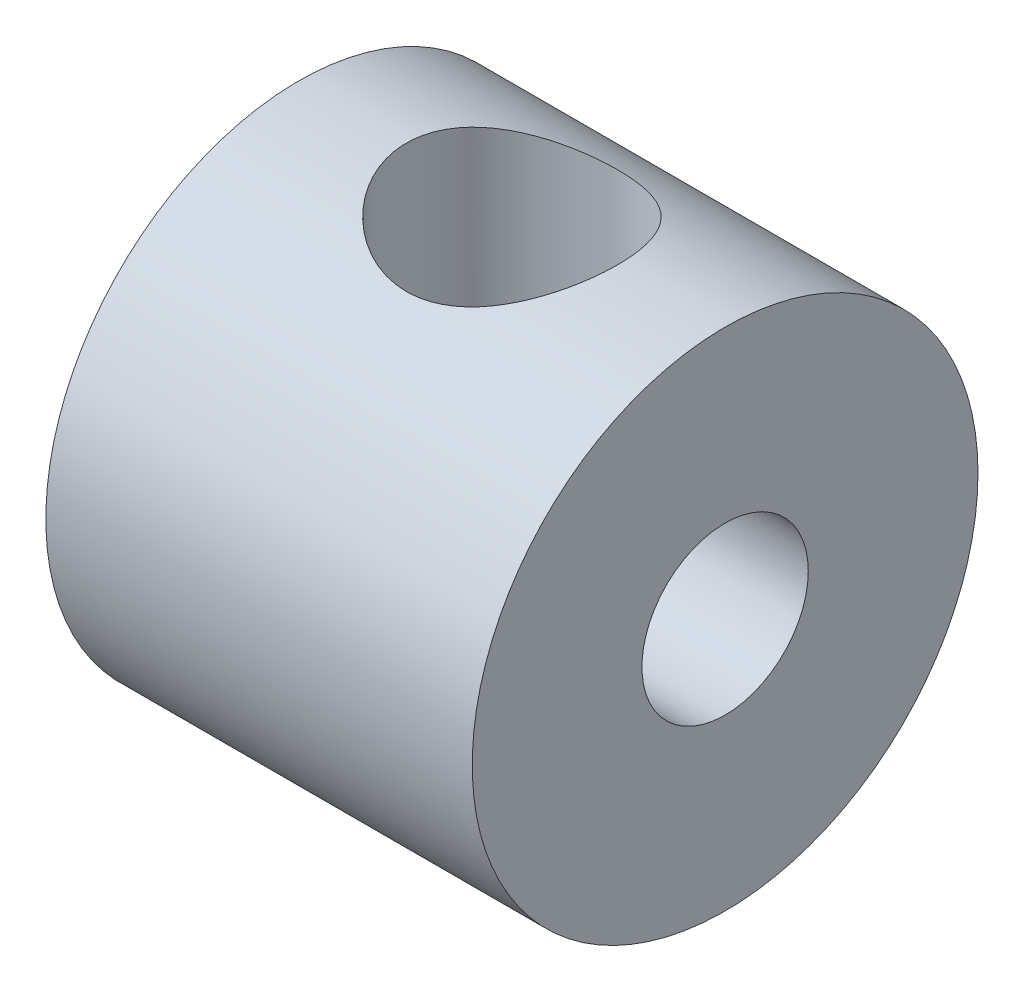
ISO-10303-21;
HEADER;
FILE_DESCRIPTION(('STEP AP214'),'2;1');
FILE_NAME('part.step','',(''),(''),'','','');
FILE_SCHEMA(('AUTOMOTIVE_DESIGN { 1 0 10303 214 1 1 1 1 }'));
ENDSEC;
DATA;
#1=APPLICATION_CONTEXT('core data for automotive mechanical design processes');
#2=APPLICATION_PROTOCOL_DEFINITION('international standard','automotive_design',2000,#1);
#3=PRODUCT_CONTEXT('',#1,'mechanical');
#4=PRODUCT('Part','Part','',(#3));
#5=PRODUCT_RELATED_PRODUCT_CATEGORY('part','',(#4));
#6=PRODUCT_DEFINITION_FORMATION('','',#4);
#7=PRODUCT_DEFINITION_CONTEXT('part definition',#1,'design');
#8=PRODUCT_DEFINITION('design','',#6,#7);
#9=PRODUCT_DEFINITION_SHAPE('','',#8);
#10=(LENGTH_UNIT() NAMED_UNIT(*) SI_UNIT(.MILLI.,.METRE.));
#11=(NAMED_UNIT(*) PLANE_ANGLE_UNIT() SI_UNIT($,.RADIAN.));
#12=(NAMED_UNIT(*) SI_UNIT($,.STERADIAN.) SOLID_ANGLE_UNIT());
#13=UNCERTAINTY_MEASURE_WITH_UNIT(LENGTH_MEASURE(1.E-05),#10,'distance_accuracy_value','');
#14=(GEOMETRIC_REPRESENTATION_CONTEXT(3) GLOBAL_UNCERTAINTY_ASSIGNED_CONTEXT((#13)) GLOBAL_UNIT_ASSIGNED_CONTEXT((#10,
#11,#12)) REPRESENTATION_CONTEXT('',''));
#15=CARTESIAN_POINT('',(0.,0.,0.));
#16=DIRECTION('',(0.,0.,1.));
#17=DIRECTION('',(1.,0.,0.));
#18=AXIS2_PLACEMENT_3D('',#15,#16,#17);
#19=CARTESIAN_POINT('',(5.05,0.,0.));
#20=DIRECTION('',(1.,0.,0.));
#21=DIRECTION('',(0.,0.,-1.));
#22=AXIS2_PLACEMENT_3D('',#19,#20,#21);
#23=PLANE('',#22);
#24=CARTESIAN_POINT('',(5.05,0.,0.));
#25=DIRECTION('',(1.,0.,0.));
#26=DIRECTION('',(0.,0.,-1.));
#27=AXIS2_PLACEMENT_3D('',#24,#25,#26);
#28=CIRCLE('',#27,2.995);
#29=CARTESIAN_POINT('',(5.05,0.,-2.995));
#30=VERTEX_POINT('',#29);
#31=EDGE_CURVE('E87',#30,#30,#28,.T.);
#32=ORIENTED_EDGE('',*,*,#31,.T.);
#33=EDGE_LOOP('',(#32));
#34=FACE_BOUND('',#33,.T.);
#35=CARTESIAN_POINT('',(5.05,0.,0.));
#36=DIRECTION('',(1.,0.,0.));
#37=DIRECTION('',(0.,0.,-1.));
#38=AXIS2_PLACEMENT_3D('',#35,#36,#37);
#39=CIRCLE('',#38,0.985);
#40=CARTESIAN_POINT('',(5.05,0.,-0.985));
#41=VERTEX_POINT('',#40);
#42=EDGE_CURVE('E114',#41,#41,#39,.T.);
#43=ORIENTED_EDGE('',*,*,#42,.F.);
#44=EDGE_LOOP('',(#43));
#45=FACE_BOUND('',#44,.T.);
#46=ADVANCED_FACE('F39',(#34,#45),#23,.T.);
#47=CARTESIAN_POINT('',(0.,0.,0.));
#48=DIRECTION('',(1.,0.,0.));
#49=DIRECTION('',(0.,0.,-1.));
#50=AXIS2_PLACEMENT_3D('',#47,#48,#49);
#51=PLANE('',#50);
#52=CARTESIAN_POINT('',(0.,0.,0.));
#53=DIRECTION('',(1.,0.,0.));
#54=DIRECTION('',(0.,0.,-1.));
#55=AXIS2_PLACEMENT_3D('',#52,#53,#54);
#56=CIRCLE('',#55,2.995);
#57=CARTESIAN_POINT('',(0.,0.,-2.995));
#58=VERTEX_POINT('',#57);
#59=EDGE_CURVE('E88',#58,#58,#56,.T.);
#60=ORIENTED_EDGE('',*,*,#59,.F.);
#61=EDGE_LOOP('',(#60));
#62=FACE_BOUND('',#61,.T.);
#63=CARTESIAN_POINT('',(0.,0.,0.));
#64=DIRECTION('',(1.,0.,0.));
#65=DIRECTION('',(0.,0.,-1.));
#66=AXIS2_PLACEMENT_3D('',#63,#64,#65);
#67=CIRCLE('',#66,0.985);
#68=CARTESIAN_POINT('',(0.,0.,-0.985));
#69=VERTEX_POINT('',#68);
#70=EDGE_CURVE('E113',#69,#69,#67,.T.);
#71=ORIENTED_EDGE('',*,*,#70,.T.);
#72=EDGE_LOOP('',(#71));
#73=FACE_BOUND('',#72,.T.);
#74=ADVANCED_FACE('F100',(#62,#73),#51,.F.);
#75=CARTESIAN_POINT('',(5.05,0.,0.));
#76=DIRECTION('',(-1.,0.,0.));
#77=DIRECTION('',(0.,0.,1.));
#78=AXIS2_PLACEMENT_3D('',#75,#76,#77);
#79=CYLINDRICAL_SURFACE('',#78,2.995);
#80=CARTESIAN_POINT('',(2.525,2.72167687281206,1.24999999999999));
#81=CARTESIAN_POINT('',(2.45833950743053,2.72168408952243,1.2499925491766));
#82=CARTESIAN_POINT('',(2.39157062400425,2.7241616164716,1.24463387112139));
#83=CARTESIAN_POINT('',(2.2599604471754,2.73375715598038,1.22340636796132));
#84=CARTESIAN_POINT('',(2.19512487971483,2.74088774993676,1.20750904562935));
#85=CARTESIAN_POINT('',(2.06952317455749,2.75882839121069,1.1659320023116));
#86=CARTESIAN_POINT('',(2.0087415875861,2.76962338650955,1.14029224903673));
#87=CARTESIAN_POINT('',(1.8923601340887,2.79365507706978,1.08007545569701));
#88=CARTESIAN_POINT('',(1.83675905801666,2.80689120021531,1.04550050897183));
#89=CARTESIAN_POINT('',(1.7288116451276,2.83523799179544,0.966086717637795));
#90=CARTESIAN_POINT('',(1.67682786416481,2.8504123652901,0.92077755556769));
#91=CARTESIAN_POINT('',(1.58092851775013,2.880402339775,0.822169034231056));
#92=CARTESIAN_POINT('',(1.53701606915572,2.8952178002566,0.768866602619853));
#93=CARTESIAN_POINT('',(1.45665473141195,2.92359539462791,0.652934709306126));
#94=CARTESIAN_POINT('',(1.42061410362992,2.93707486087493,0.590000174327917));
#95=CARTESIAN_POINT('',(1.35978846595451,2.96048162467245,0.458297259305898));
#96=CARTESIAN_POINT('',(1.33499844373665,2.9704105036474,0.389531493406963));
#97=CARTESIAN_POINT('',(1.2986927637317,2.9851455069692,0.251924950909749));
#98=CARTESIAN_POINT('',(1.28655181472748,2.99019195323718,0.183275410082142));
#99=CARTESIAN_POINT('',(1.27386814749118,2.99546663765083,0.0447404649603677));
#100=CARTESIAN_POINT('',(1.27332070815796,2.99569683706481,-0.0251444246722105));
#101=CARTESIAN_POINT('',(1.28351260263866,2.99145437257771,-0.159618562523936));
#102=CARTESIAN_POINT('',(1.29356482245612,2.987268000861,-0.224270613552609));
#103=CARTESIAN_POINT('',(1.32349243074921,2.97505624473637,-0.35087249126474));
#104=CARTESIAN_POINT('',(1.34336854351045,2.96703057727033,-0.412822118340198));
#105=CARTESIAN_POINT('',(1.39261563942231,2.94776182278982,-0.53339763971884));
#106=CARTESIAN_POINT('',(1.42212689959023,2.9364715022566,-0.591958379704035));
#107=CARTESIAN_POINT('',(1.48966884045638,2.91177759113879,-0.703449874573906));
#108=CARTESIAN_POINT('',(1.52770253529332,2.8983732533854,-0.756378627795873));
#109=CARTESIAN_POINT('',(1.61433628242724,2.86967739434905,-0.859079539865936));
#110=CARTESIAN_POINT('',(1.66349321870741,2.85431945056651,-0.908364058892213));
#111=CARTESIAN_POINT('',(1.76940771379357,2.82415828541537,-0.998201074414736));
#112=CARTESIAN_POINT('',(1.8261682113654,2.80935528137566,-1.0387501788014));
#113=CARTESIAN_POINT('',(1.94804953512258,2.78150486076302,-1.1112230192764));
#114=CARTESIAN_POINT('',(2.01338475965799,2.76853168860631,-1.14281717634742));
#115=CARTESIAN_POINT('',(2.14913353712318,2.74669484924492,-1.19435552560825));
#116=CARTESIAN_POINT('',(2.2195434038475,2.73782823313363,-1.21430808028381));
#117=CARTESIAN_POINT('',(2.358556049066,2.72594045104826,-1.24075453706962));
#118=CARTESIAN_POINT('',(2.42697854939875,2.72257662802743,-1.24803933230689));
#119=CARTESIAN_POINT('',(2.56413624569108,2.72109561255766,-1.25126707855099));
#120=CARTESIAN_POINT('',(2.63287132455769,2.7229765948535,-1.24721397528101));
#121=CARTESIAN_POINT('',(2.76404357831415,2.73141913343914,-1.22860279901627));
#122=CARTESIAN_POINT('',(2.82660144474146,2.7376717986595,-1.21473729638598));
#123=CARTESIAN_POINT('',(2.94845086392618,2.75375796529317,-1.17781346602691));
#124=CARTESIAN_POINT('',(3.0077416478097,2.76359230550772,-1.15475298478353));
#125=CARTESIAN_POINT('',(3.12418493982816,2.78624184136683,-1.09900879620814));
#126=CARTESIAN_POINT('',(3.18114005501157,2.7991657872686,-1.06595837211242));
#127=CARTESIAN_POINT('',(3.28897020024506,2.82638424205771,-0.991536917304508));
#128=CARTESIAN_POINT('',(3.33984257720538,2.84067934413456,-0.950162276797584));
#129=CARTESIAN_POINT('',(3.43839079337745,2.87043933702281,-0.856281094677779));
#130=CARTESIAN_POINT('',(3.48546552706815,2.8859043427428,-0.803141103327529));
#131=CARTESIAN_POINT('',(3.57013813968037,2.91517711399439,-0.689358120067868));
#132=CARTESIAN_POINT('',(3.60773531005939,2.92898475558107,-0.62871456769731));
#133=CARTESIAN_POINT('',(3.67234894917662,2.95347865565452,-0.501207649163145));
#134=CARTESIAN_POINT('',(3.69933669435517,2.96415642084416,-0.43432799630846));
#135=CARTESIAN_POINT('',(3.7414813295208,2.98110310503463,-0.296417640349703));
#136=CARTESIAN_POINT('',(3.75664528676724,2.9873746574742,-0.225389444228436));
#137=CARTESIAN_POINT('',(3.77381969253155,2.99449845075711,-0.0865703629343131));
#138=CARTESIAN_POINT('',(3.77667760322165,2.9956997327205,-0.0189015249784919));
#139=CARTESIAN_POINT('',(3.77143887313347,2.99351440017967,0.115927662228687));
#140=CARTESIAN_POINT('',(3.7633441641049,2.99012859471507,0.183088099047725));
#141=CARTESIAN_POINT('',(3.73703838243435,2.97933320782362,0.312523507623029));
#142=CARTESIAN_POINT('',(3.71919858064072,2.9720715106188,0.3748872934667));
#143=CARTESIAN_POINT('',(3.67431495882013,2.95432332185215,0.495712667064654));
#144=CARTESIAN_POINT('',(3.64726939342328,2.94383621880478,0.554173512323622));
#145=CARTESIAN_POINT('',(3.58337478171933,2.92006243246171,0.668446398018976));
#146=CARTESIAN_POINT('',(3.54613768976197,2.90667058754396,0.724019076752411));
#147=CARTESIAN_POINT('',(3.463481100318,2.87867346479676,0.828364316647727));
#148=CARTESIAN_POINT('',(3.41805855292326,2.86406773576969,0.877134331073715));
#149=CARTESIAN_POINT('',(3.3166616141363,2.83403476362257,0.969954852614774));
#150=CARTESIAN_POINT('',(3.26017836639232,2.8186195604929,1.01345536242744));
#151=CARTESIAN_POINT('',(3.1402349705237,2.78974171583796,1.09044193007448));
#152=CARTESIAN_POINT('',(3.07677094138471,2.77628017020614,1.12392237830834));
#153=CARTESIAN_POINT('',(2.9448042913031,2.75310119537421,1.17956230527581));
#154=CARTESIAN_POINT('',(2.87632962643144,2.74336463589933,1.20177982345532));
#155=CARTESIAN_POINT('',(2.73620510246827,2.72897901489624,1.23410910486767));
#156=CARTESIAN_POINT('',(2.66456673985871,2.72431289364734,1.24426147271535));
#157=CARTESIAN_POINT('',(2.57012355090499,2.72195512563448,1.2493917039536));
#158=CARTESIAN_POINT('',(2.54756798716388,2.72167442958638,1.2500025224849));
#159=CARTESIAN_POINT('',(2.525,2.72167687281206,1.24999999999999));
#160=B_SPLINE_CURVE_WITH_KNOTS('',3,(#80,#81,#82,#83,#84,#85,#86,#87,#88,#89,#90,#91,#92,#93,
#94,#95,#96,#97,#98,#99,#100,#101,#102,#103,#104,#105,#106,#107,#108,#109,#110,#111,#112,#113,
#114,#115,#116,#117,#118,#119,#120,#121,#122,#123,#124,#125,#126,#127,#128,#129,#130,#131,#132,
#133,#134,#135,#136,#137,#138,#139,#140,#141,#142,#143,#144,#145,#146,#147,#148,#149,#150,#151,
#152,#153,#154,#155,#156,#157,#158,#159),.UNSPECIFIED.,.T.,.F.,(4,2,2,2,2,2,2,2,2,2,2,2,2,2,2,2,
2,2,2,2,2,2,2,2,2,2,2,2,2,2,2,2,2,2,2,2,2,2,2,4),(0.,0.199916651997166,0.400376109708918,
0.600021921923467,0.79962100339577,1.01052191214147,1.22150409288721,1.44167340548643,
1.66174453261671,1.87032963067071,2.07882978720859,2.27459920926896,2.47038306696406,
2.66915489025742,2.86799712466726,3.08089572515209,3.29387684934502,3.51390111950578,
3.73376714493053,3.93933418319954,4.14482969060142,4.3371054389313,4.52942624577537,
4.72990519698246,4.9304712739617,5.14743023573343,5.36440541254698,5.58196403960156,
5.79939252863281,6.00158091612366,6.20373364762855,6.39867330644567,6.59364994552009,
6.79744439085018,7.00131492777253,7.21911247685394,7.4370317299369,7.65381629915601,
7.8698692066135,7.93755122128532),.UNSPECIFIED.);
#161=CARTESIAN_POINT('',(2.525,2.72167687281206,1.24999999999999));
#162=VERTEX_POINT('',#161);
#163=EDGE_CURVE('E108',#162,#162,#160,.T.);
#164=ORIENTED_EDGE('',*,*,#163,.T.);
#165=EDGE_LOOP('',(#164));
#166=FACE_BOUND('',#165,.T.);
#167=ORIENTED_EDGE('',*,*,#31,.F.);
#168=EDGE_LOOP('',(#167));
#169=FACE_BOUND('',#168,.T.);
#170=ORIENTED_EDGE('',*,*,#59,.T.);
#171=EDGE_LOOP('',(#170));
#172=FACE_BOUND('',#171,.T.);
#173=ADVANCED_FACE('F94',(#166,#169,#172),#79,.T.);
#174=CARTESIAN_POINT('',(5.05,0.,0.));
#175=DIRECTION('',(-1.,0.,0.));
#176=DIRECTION('',(0.,0.,1.));
#177=AXIS2_PLACEMENT_3D('',#174,#175,#176);
#178=CYLINDRICAL_SURFACE('',#177,0.985);
#179=CARTESIAN_POINT('',(3.29459404883353,0.,-0.985));
#180=CARTESIAN_POINT('',(3.29446784062204,0.0381652072526211,-0.985042674837043));
#181=CARTESIAN_POINT('',(3.29743391926315,0.0761397507327544,-0.982785791213704));
#182=CARTESIAN_POINT('',(3.30833520768369,0.150397576715312,-0.97414592122885));
#183=CARTESIAN_POINT('',(3.31620441769125,0.186696552209224,-0.9678177018008));
#184=CARTESIAN_POINT('',(3.33911172021046,0.26947635200639,-0.948681735386974));
#185=CARTESIAN_POINT('',(3.35568388716526,0.315171065024187,-0.934394867955088));
#186=CARTESIAN_POINT('',(3.39276995635581,0.402913542609491,-0.900068169788876));
#187=CARTESIAN_POINT('',(3.41331117494434,0.444932918500013,-0.879987965467468));
#188=CARTESIAN_POINT('',(3.46320672054947,0.538530919605133,-0.827038154909851));
#189=CARTESIAN_POINT('',(3.49321314082572,0.58861486292883,-0.792136954279987));
#190=CARTESIAN_POINT('',(3.55248583746894,0.681705754588154,-0.71358067121232));
#191=CARTESIAN_POINT('',(3.58175335136087,0.724725306378276,-0.66994149378028));
#192=CARTESIAN_POINT('',(3.63146524198896,0.795289694110268,-0.583292916609573));
#193=CARTESIAN_POINT('',(3.65252506076731,0.824219939468458,-0.541769192840997));
#194=CARTESIAN_POINT('',(3.69084175335214,0.875906920754355,-0.453453737194951));
#195=CARTESIAN_POINT('',(3.70810378323872,0.89867203661475,-0.406669279693915));
#196=CARTESIAN_POINT('',(3.73506371547434,0.933854862348391,-0.316389524841108));
#197=CARTESIAN_POINT('',(3.74552543378321,0.947338575701927,-0.27354036382879));
#198=CARTESIAN_POINT('',(3.76195468697313,0.968414159748699,-0.18557994846842));
#199=CARTESIAN_POINT('',(3.76792474103117,0.976009333138083,-0.140469977275532));
#200=CARTESIAN_POINT('',(3.77487809203116,0.984849143489171,-0.0490928121429602));
#201=CARTESIAN_POINT('',(3.77584524176177,0.986073217375817,-0.00282235484444629));
#202=CARTESIAN_POINT('',(3.77266020561179,0.982029795811859,0.0892545800165783));
#203=CARTESIAN_POINT('',(3.76850765899118,0.976761842925177,0.135061024654896));
#204=CARTESIAN_POINT('',(3.75578367340726,0.960508844354726,0.222552247556708));
#205=CARTESIAN_POINT('',(3.74744492799725,0.949824589567653,0.264328459550827));
#206=CARTESIAN_POINT('',(3.72708280774814,0.923470566390753,0.345315091819529));
#207=CARTESIAN_POINT('',(3.71505838630766,0.907799381841258,0.384524779449223));
#208=CARTESIAN_POINT('',(3.68670743937506,0.870318715349794,0.463539737791961));
#209=CARTESIAN_POINT('',(3.67007182716367,0.848053507350921,0.503015810855073));
#210=CARTESIAN_POINT('',(3.63424203433311,0.799013882152448,0.577756605857543));
#211=CARTESIAN_POINT('',(3.61504676426214,0.772237543622045,0.613019522391983));
#212=CARTESIAN_POINT('',(3.57102221170315,0.708880237251297,0.685930382137679));
#213=CARTESIAN_POINT('',(3.54584263998237,0.671413560895693,0.722596174225636));
#214=CARTESIAN_POINT('',(3.49500893594406,0.591278018960083,0.789524852391342));
#215=CARTESIAN_POINT('',(3.46935393780461,0.548598662796091,0.819774479775857));
#216=CARTESIAN_POINT('',(3.42297175618361,0.46386690968856,0.870153640732227));
#217=CARTESIAN_POINT('',(3.40202985816047,0.422405721612635,0.891076223756251));
#218=CARTESIAN_POINT('',(3.36375349460633,0.335758227504681,0.927188755033356));
#219=CARTESIAN_POINT('',(3.34639732393048,0.290596793532827,0.94241367692058));
#220=CARTESIAN_POINT('',(3.3206305160697,0.205137554717056,0.964214137550111));
#221=CARTESIAN_POINT('',(3.31116621721972,0.16545261667149,0.971860121930214));
#222=CARTESIAN_POINT('',(3.30138577417326,0.10446032738876,0.979664538588745));
#223=CARTESIAN_POINT('',(3.29885980058135,0.0837292583806017,0.98165600595699));
#224=CARTESIAN_POINT('',(3.29545527195962,0.04200485023779,0.98432744882807));
#225=CARTESIAN_POINT('',(3.29458029192545,0.0210110408242212,0.985004578406941));
#226=CARTESIAN_POINT('',(3.29459404883355,0.,0.985000000000002));
#227=B_SPLINE_CURVE_WITH_KNOTS('',3,(#179,#180,#181,#182,#183,#184,#185,#186,#187,#188,#189,
#190,#191,#192,#193,#194,#195,#196,#197,#198,#199,#200,#201,#202,#203,#204,#205,#206,#207,#208,
#209,#210,#211,#212,#213,#214,#215,#216,#217,#218,#219,#220,#221,#222,#223,#224,#225,#226),
.UNSPECIFIED.,.F.,.F.,(4,2,2,2,2,2,2,2,2,2,2,2,2,2,2,2,2,2,2,2,2,2,2,4),(0.,0.114008964594697,
0.226515485771723,0.377672407891983,0.52990929237866,0.732992948116063,0.935710254204296,
1.09953251140412,1.26313096317134,1.40091082067502,1.53861334579084,1.67676003902486,
1.814916466799,1.94612599852675,2.07737282368364,2.22168366853981,2.36605613277903,
2.53989495029589,2.7140895709681,2.86646284637003,3.01788484834091,3.14172033312678,
3.20455838872292,3.26753235588565),.UNSPECIFIED.);
#228=CARTESIAN_POINT('',(3.29459404883354,0.,-0.985));
#229=VERTEX_POINT('',#228);
#230=CARTESIAN_POINT('',(3.29459404883354,0.,0.985));
#231=VERTEX_POINT('',#230);
#232=EDGE_CURVE('E11',#229,#231,#227,.T.);
#233=ORIENTED_EDGE('',*,*,#232,.F.);
#234=DIRECTION('',(-1.,0.,0.));
#235=VECTOR('',#234,1.);
#236=CARTESIAN_POINT('',(5.05,0.,-0.985));
#237=LINE('',#236,#235);
#238=CARTESIAN_POINT('',(1.75540595116646,0.,-0.985));
#239=VERTEX_POINT('',#238);
#240=EDGE_CURVE('E80',#239,#229,#237,.F.);
#241=ORIENTED_EDGE('',*,*,#240,.F.);
#242=CARTESIAN_POINT('',(1.75540595116647,0.,0.985));
#243=CARTESIAN_POINT('',(1.75553215937796,0.0381652072526211,0.985042674837043));
#244=CARTESIAN_POINT('',(1.75256608073685,0.0761397507327544,0.982785791213704));
#245=CARTESIAN_POINT('',(1.74166479231631,0.150397576715312,0.97414592122885));
#246=CARTESIAN_POINT('',(1.73379558230875,0.186696552209225,0.9678177018008));
#247=CARTESIAN_POINT('',(1.71088827978954,0.26947635200639,0.948681735386974));
#248=CARTESIAN_POINT('',(1.69431611283474,0.315171065024187,0.934394867955088));
#249=CARTESIAN_POINT('',(1.65723004364419,0.402913542609491,0.900068169788876));
#250=CARTESIAN_POINT('',(1.63668882505566,0.444932918500013,0.879987965467468));
#251=CARTESIAN_POINT('',(1.58679327945053,0.538530919605133,0.827038154909851));
#252=CARTESIAN_POINT('',(1.55678685917428,0.588614862928829,0.792136954279987));
#253=CARTESIAN_POINT('',(1.49751416253106,0.681705754588154,0.71358067121232));
#254=CARTESIAN_POINT('',(1.46824664863913,0.724725306378275,0.669941493780281));
#255=CARTESIAN_POINT('',(1.41853475801104,0.795289694110268,0.583292916609573));
#256=CARTESIAN_POINT('',(1.39747493923269,0.824219939468458,0.541769192840997));
#257=CARTESIAN_POINT('',(1.35915824664786,0.875906920754355,0.453453737194951));
#258=CARTESIAN_POINT('',(1.34189621676128,0.89867203661475,0.406669279693915));
#259=CARTESIAN_POINT('',(1.31493628452566,0.933854862348391,0.316389524841108));
#260=CARTESIAN_POINT('',(1.30447456621679,0.947338575701927,0.27354036382879));
#261=CARTESIAN_POINT('',(1.28804531302687,0.968414159748699,0.18557994846842));
#262=CARTESIAN_POINT('',(1.28207525896882,0.976009333138084,0.140469977275532));
#263=CARTESIAN_POINT('',(1.27512190796884,0.984849143489171,0.0490928121429605));
#264=CARTESIAN_POINT('',(1.27415475823823,0.986073217375817,0.00282235484444657));
#265=CARTESIAN_POINT('',(1.27733979438821,0.982029795811859,-0.0892545800165782));
#266=CARTESIAN_POINT('',(1.28149234100882,0.976761842925177,-0.135061024654896));
#267=CARTESIAN_POINT('',(1.29421632659274,0.960508844354726,-0.222552247556708));
#268=CARTESIAN_POINT('',(1.30255507200275,0.949824589567653,-0.264328459550827));
#269=CARTESIAN_POINT('',(1.32291719225186,0.923470566390753,-0.345315091819529));
#270=CARTESIAN_POINT('',(1.33494161369234,0.907799381841259,-0.384524779449223));
#271=CARTESIAN_POINT('',(1.36329256062494,0.870318715349795,-0.463539737791961));
#272=CARTESIAN_POINT('',(1.37992817283633,0.848053507350922,-0.503015810855072));
#273=CARTESIAN_POINT('',(1.41575796566689,0.799013882152448,-0.577756605857542));
#274=CARTESIAN_POINT('',(1.43495323573786,0.772237543622045,-0.613019522391983));
#275=CARTESIAN_POINT('',(1.47897778829685,0.708880237251297,-0.685930382137679));
#276=CARTESIAN_POINT('',(1.50415736001763,0.671413560895693,-0.722596174225636));
#277=CARTESIAN_POINT('',(1.55499106405594,0.591278018960083,-0.789524852391342));
#278=CARTESIAN_POINT('',(1.58064606219539,0.548598662796092,-0.819774479775856));
#279=CARTESIAN_POINT('',(1.62702824381639,0.463866909688561,-0.870153640732227));
#280=CARTESIAN_POINT('',(1.64797014183953,0.422405721612635,-0.891076223756251));
#281=CARTESIAN_POINT('',(1.68624650539367,0.335758227504681,-0.927188755033356));
#282=CARTESIAN_POINT('',(1.70360267606952,0.290596793532827,-0.94241367692058));
#283=CARTESIAN_POINT('',(1.7293694839303,0.205137554717057,-0.964214137550111));
#284=CARTESIAN_POINT('',(1.73883378278028,0.165452616671491,-0.971860121930214));
#285=CARTESIAN_POINT('',(1.74861422582674,0.10446032738876,-0.979664538588745));
#286=CARTESIAN_POINT('',(1.75114019941865,0.0837292583806018,-0.98165600595699));
#287=CARTESIAN_POINT('',(1.75454472804038,0.0420048502377901,-0.98432744882807));
#288=CARTESIAN_POINT('',(1.75541970807455,0.0210110408242212,-0.985004578406941));
#289=CARTESIAN_POINT('',(1.75540595116645,0.,-0.985000000000002));
#290=B_SPLINE_CURVE_WITH_KNOTS('',3,(#242,#243,#244,#245,#246,#247,#248,#249,#250,#251,#252,
#253,#254,#255,#256,#257,#258,#259,#260,#261,#262,#263,#264,#265,#266,#267,#268,#269,#270,#271,
#272,#273,#274,#275,#276,#277,#278,#279,#280,#281,#282,#283,#284,#285,#286,#287,#288,#289),
.UNSPECIFIED.,.F.,.F.,(4,2,2,2,2,2,2,2,2,2,2,2,2,2,2,2,2,2,2,2,2,2,2,4),(0.,0.114008964594697,
0.226515485771724,0.377672407891983,0.529909292378659,0.732992948116063,0.935710254204295,
1.09953251140412,1.26313096317133,1.40091082067502,1.53861334579083,1.67676003902486,
1.814916466799,1.94612599852675,2.07737282368364,2.22168366853981,2.36605613277903,
2.53989495029588,2.7140895709681,2.86646284637002,3.01788484834091,3.14172033312678,
3.20455838872292,3.26753235588565),.UNSPECIFIED.);
#291=CARTESIAN_POINT('',(1.75540595116647,0.,0.985));
#292=VERTEX_POINT('',#291);
#293=EDGE_CURVE('E62',#292,#239,#290,.T.);
#294=ORIENTED_EDGE('',*,*,#293,.F.);
#295=DIRECTION('',(-1.,0.,0.));
#296=VECTOR('',#295,1.);
#297=CARTESIAN_POINT('',(5.05,0.,0.985));
#298=LINE('',#297,#296);
#299=EDGE_CURVE('E51',#231,#292,#298,.T.);
#300=ORIENTED_EDGE('',*,*,#299,.F.);
#301=EDGE_LOOP('',(#233,#241,#294,#300));
#302=FACE_BOUND('',#301,.T.);
#303=ORIENTED_EDGE('',*,*,#42,.T.);
#304=EDGE_LOOP('',(#303));
#305=FACE_BOUND('',#304,.T.);
#306=ORIENTED_EDGE('',*,*,#70,.F.);
#307=EDGE_LOOP('',(#306));
#308=FACE_BOUND('',#307,.T.);
#309=ADVANCED_FACE('F78',(#302,#305,#308),#178,.F.);
#310=CARTESIAN_POINT('',(2.525,2.995,0.));
#311=DIRECTION('',(0.,1.,0.));
#312=DIRECTION('',(0.,0.,1.));
#313=AXIS2_PLACEMENT_3D('',#310,#311,#312);
#314=CYLINDRICAL_SURFACE('',#313,1.24999999999999);
#315=ORIENTED_EDGE('',*,*,#232,.T.);
#316=CARTESIAN_POINT('',(2.525,0.,0.));
#317=DIRECTION('',(0.,1.,0.));
#318=DIRECTION('',(0.,0.,1.));
#319=AXIS2_PLACEMENT_3D('',#316,#317,#318);
#320=CIRCLE('',#319,1.25);
#321=EDGE_CURVE('E57',#292,#231,#320,.T.);
#322=ORIENTED_EDGE('',*,*,#321,.F.);
#323=ORIENTED_EDGE('',*,*,#293,.T.);
#324=EDGE_CURVE('E71',#229,#239,#320,.T.);
#325=ORIENTED_EDGE('',*,*,#324,.F.);
#326=EDGE_LOOP('',(#315,#322,#323,#325));
#327=FACE_BOUND('',#326,.T.);
#328=ORIENTED_EDGE('',*,*,#163,.F.);
#329=EDGE_LOOP('',(#328));
#330=FACE_BOUND('',#329,.T.);
#331=ADVANCED_FACE('F69',(#327,#330),#314,.F.);
#332=CARTESIAN_POINT('',(2.525,0.,0.));
#333=DIRECTION('',(0.,-1.,0.));
#334=DIRECTION('',(0.,0.,-1.));
#335=AXIS2_PLACEMENT_3D('',#332,#333,#334);
#336=PLANE('',#335);
#337=ORIENTED_EDGE('',*,*,#299,.T.);
#338=ORIENTED_EDGE('',*,*,#321,.T.);
#339=EDGE_LOOP('',(#337,#338));
#340=FACE_BOUND('',#339,.T.);
#341=ADVANCED_FACE('F76',(#340),#336,.F.);
#342=ORIENTED_EDGE('',*,*,#240,.T.);
#343=ORIENTED_EDGE('',*,*,#324,.T.);
#344=EDGE_LOOP('',(#342,#343));
#345=FACE_BOUND('',#344,.T.);
#346=ADVANCED_FACE('F131',(#345),#336,.F.);
#347=CLOSED_SHELL('',(#46,#74,#173,#309,#331,#341,#346));
#348=MANIFOLD_SOLID_BREP('B2',#347);
#349=ADVANCED_BREP_SHAPE_REPRESENTATION('',(#18,#348),#14);
#350=SHAPE_DEFINITION_REPRESENTATION(#9,#349);
ENDSEC;
END-ISO-10303-21;
